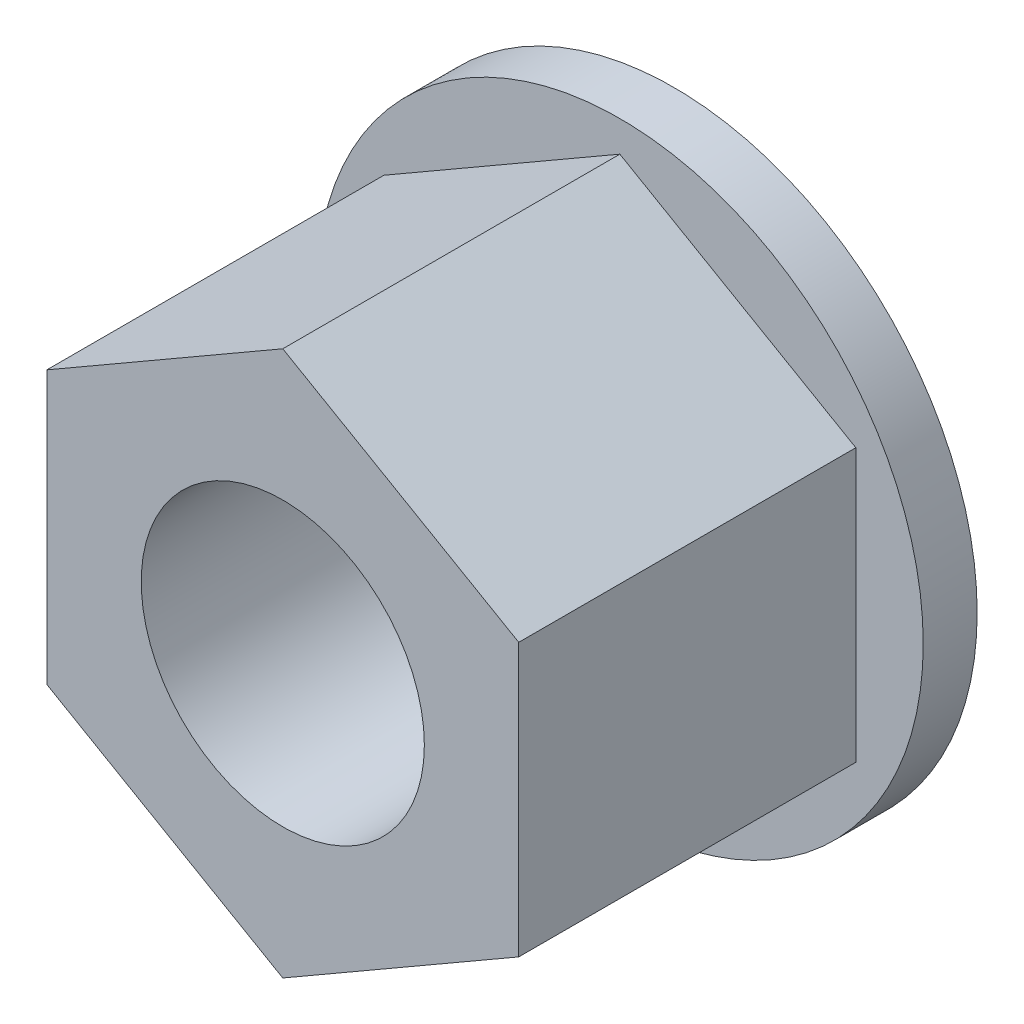
ISO-10303-21;
HEADER;
FILE_DESCRIPTION(('STEP AP214'),'2;1');
FILE_NAME('part.step','',(''),(''),'','','');
FILE_SCHEMA(('AUTOMOTIVE_DESIGN { 1 0 10303 214 1 1 1 1 }'));
ENDSEC;
DATA;
#1=APPLICATION_CONTEXT('core data for automotive mechanical design processes');
#2=APPLICATION_PROTOCOL_DEFINITION('international standard','automotive_design',2000,#1);
#3=PRODUCT_CONTEXT('',#1,'mechanical');
#4=PRODUCT('Part','Part','',(#3));
#5=PRODUCT_RELATED_PRODUCT_CATEGORY('part','',(#4));
#6=PRODUCT_DEFINITION_FORMATION('','',#4);
#7=PRODUCT_DEFINITION_CONTEXT('part definition',#1,'design');
#8=PRODUCT_DEFINITION('design','',#6,#7);
#9=PRODUCT_DEFINITION_SHAPE('','',#8);
#10=(LENGTH_UNIT() NAMED_UNIT(*) SI_UNIT(.MILLI.,.METRE.));
#11=(NAMED_UNIT(*) PLANE_ANGLE_UNIT() SI_UNIT($,.RADIAN.));
#12=(NAMED_UNIT(*) SI_UNIT($,.STERADIAN.) SOLID_ANGLE_UNIT());
#13=UNCERTAINTY_MEASURE_WITH_UNIT(LENGTH_MEASURE(1.E-05),#10,'distance_accuracy_value','');
#14=(GEOMETRIC_REPRESENTATION_CONTEXT(3) GLOBAL_UNCERTAINTY_ASSIGNED_CONTEXT((#13)) GLOBAL_UNIT_ASSIGNED_CONTEXT((#10,
#11,#12)) REPRESENTATION_CONTEXT('',''));
#15=CARTESIAN_POINT('',(0.,0.,0.));
#16=DIRECTION('',(0.,0.,1.));
#17=DIRECTION('',(1.,0.,0.));
#18=AXIS2_PLACEMENT_3D('',#15,#16,#17);
#19=CARTESIAN_POINT('',(0.,0.,0.8));
#20=DIRECTION('',(0.,0.,1.));
#21=DIRECTION('',(1.,0.,0.));
#22=AXIS2_PLACEMENT_3D('',#19,#20,#21);
#23=PLANE('',#22);
#24=DIRECTION('',(0.,1.,0.));
#25=VECTOR('',#24,1.);
#26=CARTESIAN_POINT('',(3.49999999985824,-2.020725942,0.8));
#27=LINE('',#26,#25);
#28=CARTESIAN_POINT('',(3.49999999985824,-2.020725942,0.8));
#29=VERTEX_POINT('',#28);
#30=CARTESIAN_POINT('',(3.49999999985824,2.020725942,0.8));
#31=VERTEX_POINT('',#30);
#32=EDGE_CURVE('E61',#29,#31,#27,.T.);
#33=ORIENTED_EDGE('',*,*,#32,.F.);
#34=DIRECTION('',(0.866025403784439,0.5,0.));
#35=VECTOR('',#34,1.);
#36=CARTESIAN_POINT('',(-7.08800422868916E-11,-4.04145188412277,0.8));
#37=LINE('',#36,#35);
#38=CARTESIAN_POINT('',(-7.08800422868916E-11,-4.04145188412277,0.8));
#39=VERTEX_POINT('',#38);
#40=EDGE_CURVE('E65',#39,#29,#37,.T.);
#41=ORIENTED_EDGE('',*,*,#40,.F.);
#42=DIRECTION('',(0.866025403784439,-0.5,0.));
#43=VECTOR('',#42,1.);
#44=CARTESIAN_POINT('',(-3.5,-2.020725942,0.8));
#45=LINE('',#44,#43);
#46=CARTESIAN_POINT('',(-3.5,-2.020725942,0.8));
#47=VERTEX_POINT('',#46);
#48=EDGE_CURVE('E150',#47,#39,#45,.T.);
#49=ORIENTED_EDGE('',*,*,#48,.F.);
#50=DIRECTION('',(0.,-1.,0.));
#51=VECTOR('',#50,1.);
#52=CARTESIAN_POINT('',(-3.5,2.020725942,0.8));
#53=LINE('',#52,#51);
#54=CARTESIAN_POINT('',(-3.5,2.020725942,0.8));
#55=VERTEX_POINT('',#54);
#56=EDGE_CURVE('E153',#55,#47,#53,.T.);
#57=ORIENTED_EDGE('',*,*,#56,.F.);
#58=DIRECTION('',(-0.866025403784439,-0.5,0.));
#59=VECTOR('',#58,1.);
#60=CARTESIAN_POINT('',(-7.08800422868916E-11,4.04145188412277,0.8));
#61=LINE('',#60,#59);
#62=CARTESIAN_POINT('',(-7.08800422868916E-11,4.04145188412277,0.8));
#63=VERTEX_POINT('',#62);
#64=EDGE_CURVE('E157',#63,#55,#61,.T.);
#65=ORIENTED_EDGE('',*,*,#64,.F.);
#66=DIRECTION('',(-0.866025403784439,0.5,0.));
#67=VECTOR('',#66,1.);
#68=CARTESIAN_POINT('',(3.49999999985824,2.020725942,0.8));
#69=LINE('',#68,#67);
#70=EDGE_CURVE('E161',#31,#63,#69,.T.);
#71=ORIENTED_EDGE('',*,*,#70,.F.);
#72=EDGE_LOOP('',(#33,#41,#49,#57,#65,#71));
#73=FACE_BOUND('',#72,.T.);
#74=CARTESIAN_POINT('',(0.,0.,0.8));
#75=DIRECTION('',(0.,0.,1.));
#76=DIRECTION('',(1.,0.,0.));
#77=AXIS2_PLACEMENT_3D('',#74,#75,#76);
#78=CIRCLE('',#77,4.5);
#79=CARTESIAN_POINT('',(4.5,0.,0.8));
#80=VERTEX_POINT('',#79);
#81=EDGE_CURVE('E11',#80,#80,#78,.T.);
#82=ORIENTED_EDGE('',*,*,#81,.T.);
#83=EDGE_LOOP('',(#82));
#84=FACE_BOUND('',#83,.T.);
#85=ADVANCED_FACE('F45',(#73,#84),#23,.T.);
#86=CARTESIAN_POINT('',(0.,0.,0.));
#87=DIRECTION('',(0.,0.,1.));
#88=DIRECTION('',(1.,0.,0.));
#89=AXIS2_PLACEMENT_3D('',#86,#87,#88);
#90=PLANE('',#89);
#91=CARTESIAN_POINT('',(0.,0.,0.));
#92=DIRECTION('',(0.,0.,1.));
#93=DIRECTION('',(1.,0.,0.));
#94=AXIS2_PLACEMENT_3D('',#91,#92,#93);
#95=CIRCLE('',#94,4.5);
#96=CARTESIAN_POINT('',(4.5,0.,0.));
#97=VERTEX_POINT('',#96);
#98=EDGE_CURVE('E49',#97,#97,#95,.T.);
#99=ORIENTED_EDGE('',*,*,#98,.F.);
#100=EDGE_LOOP('',(#99));
#101=FACE_BOUND('',#100,.T.);
#102=CARTESIAN_POINT('',(0.,0.,0.));
#103=DIRECTION('',(0.,0.,1.));
#104=DIRECTION('',(1.,0.,0.));
#105=AXIS2_PLACEMENT_3D('',#102,#103,#104);
#106=CIRCLE('',#105,2.1);
#107=CARTESIAN_POINT('',(2.1,0.,0.));
#108=VERTEX_POINT('',#107);
#109=EDGE_CURVE('E123',#108,#108,#106,.T.);
#110=ORIENTED_EDGE('',*,*,#109,.T.);
#111=EDGE_LOOP('',(#110));
#112=FACE_BOUND('',#111,.T.);
#113=ADVANCED_FACE('F190',(#101,#112),#90,.F.);
#114=CARTESIAN_POINT('',(0.,0.,0.8));
#115=DIRECTION('',(0.,0.,-1.));
#116=DIRECTION('',(-1.,0.,0.));
#117=AXIS2_PLACEMENT_3D('',#114,#115,#116);
#118=CYLINDRICAL_SURFACE('',#117,4.5);
#119=ORIENTED_EDGE('',*,*,#81,.F.);
#120=EDGE_LOOP('',(#119));
#121=FACE_BOUND('',#120,.T.);
#122=ORIENTED_EDGE('',*,*,#98,.T.);
#123=EDGE_LOOP('',(#122));
#124=FACE_BOUND('',#123,.T.);
#125=ADVANCED_FACE('F47',(#121,#124),#118,.T.);
#126=CARTESIAN_POINT('',(0.,0.,0.8));
#127=DIRECTION('',(0.,0.,-1.));
#128=DIRECTION('',(-1.,0.,0.));
#129=AXIS2_PLACEMENT_3D('',#126,#127,#128);
#130=CYLINDRICAL_SURFACE('',#129,2.1);
#131=ORIENTED_EDGE('',*,*,#109,.F.);
#132=EDGE_LOOP('',(#131));
#133=FACE_BOUND('',#132,.T.);
#134=CARTESIAN_POINT('',(0.,0.,5.8));
#135=DIRECTION('',(0.,0.,1.));
#136=DIRECTION('',(1.,0.,0.));
#137=AXIS2_PLACEMENT_3D('',#134,#135,#136);
#138=CIRCLE('',#137,2.1);
#139=CARTESIAN_POINT('',(2.1,0.,5.8));
#140=VERTEX_POINT('',#139);
#141=EDGE_CURVE('E166',#140,#140,#138,.T.);
#142=ORIENTED_EDGE('',*,*,#141,.T.);
#143=EDGE_LOOP('',(#142));
#144=FACE_BOUND('',#143,.T.);
#145=ADVANCED_FACE('F179',(#133,#144),#130,.F.);
#146=CARTESIAN_POINT('',(0.,0.,5.8));
#147=DIRECTION('',(0.,0.,1.));
#148=DIRECTION('',(1.,0.,0.));
#149=AXIS2_PLACEMENT_3D('',#146,#147,#148);
#150=PLANE('',#149);
#151=DIRECTION('',(0.,1.,0.));
#152=VECTOR('',#151,1.);
#153=CARTESIAN_POINT('',(3.49999999985824,-2.020725942,5.8));
#154=LINE('',#153,#152);
#155=CARTESIAN_POINT('',(3.49999999985824,-2.020725942,5.8));
#156=VERTEX_POINT('',#155);
#157=CARTESIAN_POINT('',(3.49999999985824,2.020725942,5.8));
#158=VERTEX_POINT('',#157);
#159=EDGE_CURVE('E109',#156,#158,#154,.T.);
#160=ORIENTED_EDGE('',*,*,#159,.T.);
#161=DIRECTION('',(-0.866025403784439,0.5,0.));
#162=VECTOR('',#161,1.);
#163=CARTESIAN_POINT('',(3.49999999985824,2.020725942,5.8));
#164=LINE('',#163,#162);
#165=CARTESIAN_POINT('',(-7.08800422868916E-11,4.04145188412277,5.8));
#166=VERTEX_POINT('',#165);
#167=EDGE_CURVE('E97',#158,#166,#164,.T.);
#168=ORIENTED_EDGE('',*,*,#167,.T.);
#169=DIRECTION('',(-0.866025403784439,-0.5,0.));
#170=VECTOR('',#169,1.);
#171=CARTESIAN_POINT('',(-7.08800422868916E-11,4.04145188412277,5.8));
#172=LINE('',#171,#170);
#173=CARTESIAN_POINT('',(-3.5,2.020725942,5.8));
#174=VERTEX_POINT('',#173);
#175=EDGE_CURVE('E108',#166,#174,#172,.T.);
#176=ORIENTED_EDGE('',*,*,#175,.T.);
#177=DIRECTION('',(0.,-1.,0.));
#178=VECTOR('',#177,1.);
#179=CARTESIAN_POINT('',(-3.5,2.020725942,5.8));
#180=LINE('',#179,#178);
#181=CARTESIAN_POINT('',(-3.5,-2.020725942,5.8));
#182=VERTEX_POINT('',#181);
#183=EDGE_CURVE('E172',#174,#182,#180,.T.);
#184=ORIENTED_EDGE('',*,*,#183,.T.);
#185=DIRECTION('',(0.866025403784439,-0.5,0.));
#186=VECTOR('',#185,1.);
#187=CARTESIAN_POINT('',(-3.5,-2.020725942,5.8));
#188=LINE('',#187,#186);
#189=CARTESIAN_POINT('',(-7.08800422868916E-11,-4.04145188412277,5.8));
#190=VERTEX_POINT('',#189);
#191=EDGE_CURVE('E169',#182,#190,#188,.T.);
#192=ORIENTED_EDGE('',*,*,#191,.T.);
#193=DIRECTION('',(0.866025403784439,0.5,0.));
#194=VECTOR('',#193,1.);
#195=CARTESIAN_POINT('',(-7.08800422868916E-11,-4.04145188412277,5.8));
#196=LINE('',#195,#194);
#197=EDGE_CURVE('E115',#190,#156,#196,.T.);
#198=ORIENTED_EDGE('',*,*,#197,.T.);
#199=EDGE_LOOP('',(#160,#168,#176,#184,#192,#198));
#200=FACE_BOUND('',#199,.T.);
#201=ORIENTED_EDGE('',*,*,#141,.F.);
#202=EDGE_LOOP('',(#201));
#203=FACE_BOUND('',#202,.T.);
#204=ADVANCED_FACE('F112',(#200,#203),#150,.T.);
#205=CARTESIAN_POINT('',(3.49999999985824,-2.020725942,5.8));
#206=DIRECTION('',(-1.,0.,0.));
#207=DIRECTION('',(0.,0.,1.));
#208=AXIS2_PLACEMENT_3D('',#205,#206,#207);
#209=PLANE('',#208);
#210=ORIENTED_EDGE('',*,*,#32,.T.);
#211=DIRECTION('',(0.,0.,-1.));
#212=VECTOR('',#211,1.);
#213=CARTESIAN_POINT('',(3.49999999985824,2.020725942,5.8));
#214=LINE('',#213,#212);
#215=EDGE_CURVE('E102',#158,#31,#214,.T.);
#216=ORIENTED_EDGE('',*,*,#215,.F.);
#217=ORIENTED_EDGE('',*,*,#159,.F.);
#218=DIRECTION('',(0.,0.,-1.));
#219=VECTOR('',#218,1.);
#220=CARTESIAN_POINT('',(3.49999999985824,-2.020725942,5.8));
#221=LINE('',#220,#219);
#222=EDGE_CURVE('E145',#156,#29,#221,.T.);
#223=ORIENTED_EDGE('',*,*,#222,.T.);
#224=EDGE_LOOP('',(#210,#216,#217,#223));
#225=FACE_BOUND('',#224,.T.);
#226=ADVANCED_FACE('F121',(#225),#209,.F.);
#227=CARTESIAN_POINT('',(3.49999999985824,2.020725942,5.8));
#228=DIRECTION('',(-0.5,-0.866025403784439,0.));
#229=DIRECTION('',(0.866025403784439,-0.5,0.));
#230=AXIS2_PLACEMENT_3D('',#227,#228,#229);
#231=PLANE('',#230);
#232=ORIENTED_EDGE('',*,*,#70,.T.);
#233=DIRECTION('',(0.,0.,-1.));
#234=VECTOR('',#233,1.);
#235=CARTESIAN_POINT('',(-7.08800422868916E-11,4.04145188412277,5.8));
#236=LINE('',#235,#234);
#237=EDGE_CURVE('E104',#166,#63,#236,.T.);
#238=ORIENTED_EDGE('',*,*,#237,.F.);
#239=ORIENTED_EDGE('',*,*,#167,.F.);
#240=ORIENTED_EDGE('',*,*,#215,.T.);
#241=EDGE_LOOP('',(#232,#238,#239,#240));
#242=FACE_BOUND('',#241,.T.);
#243=ADVANCED_FACE('F100',(#242),#231,.F.);
#244=CARTESIAN_POINT('',(-7.08800422868916E-11,4.04145188412277,5.8));
#245=DIRECTION('',(0.5,-0.866025403784439,0.));
#246=DIRECTION('',(0.866025403784439,0.5,0.));
#247=AXIS2_PLACEMENT_3D('',#244,#245,#246);
#248=PLANE('',#247);
#249=ORIENTED_EDGE('',*,*,#64,.T.);
#250=DIRECTION('',(0.,0.,-1.));
#251=VECTOR('',#250,1.);
#252=CARTESIAN_POINT('',(-3.5,2.020725942,5.8));
#253=LINE('',#252,#251);
#254=EDGE_CURVE('E131',#174,#55,#253,.T.);
#255=ORIENTED_EDGE('',*,*,#254,.F.);
#256=ORIENTED_EDGE('',*,*,#175,.F.);
#257=ORIENTED_EDGE('',*,*,#237,.T.);
#258=EDGE_LOOP('',(#249,#255,#256,#257));
#259=FACE_BOUND('',#258,.T.);
#260=ADVANCED_FACE('F199',(#259),#248,.F.);
#261=CARTESIAN_POINT('',(-3.5,2.020725942,5.8));
#262=DIRECTION('',(1.,0.,0.));
#263=DIRECTION('',(0.,0.,-1.));
#264=AXIS2_PLACEMENT_3D('',#261,#262,#263);
#265=PLANE('',#264);
#266=ORIENTED_EDGE('',*,*,#56,.T.);
#267=DIRECTION('',(0.,0.,-1.));
#268=VECTOR('',#267,1.);
#269=CARTESIAN_POINT('',(-3.5,-2.020725942,5.8));
#270=LINE('',#269,#268);
#271=EDGE_CURVE('E137',#182,#47,#270,.T.);
#272=ORIENTED_EDGE('',*,*,#271,.F.);
#273=ORIENTED_EDGE('',*,*,#183,.F.);
#274=ORIENTED_EDGE('',*,*,#254,.T.);
#275=EDGE_LOOP('',(#266,#272,#273,#274));
#276=FACE_BOUND('',#275,.T.);
#277=ADVANCED_FACE('F202',(#276),#265,.F.);
#278=CARTESIAN_POINT('',(-3.5,-2.020725942,5.8));
#279=DIRECTION('',(0.5,0.866025403784439,0.));
#280=DIRECTION('',(-0.866025403784439,0.5,0.));
#281=AXIS2_PLACEMENT_3D('',#278,#279,#280);
#282=PLANE('',#281);
#283=ORIENTED_EDGE('',*,*,#48,.T.);
#284=DIRECTION('',(0.,0.,-1.));
#285=VECTOR('',#284,1.);
#286=CARTESIAN_POINT('',(-7.08800422868916E-11,-4.04145188412277,5.8));
#287=LINE('',#286,#285);
#288=EDGE_CURVE('E141',#190,#39,#287,.T.);
#289=ORIENTED_EDGE('',*,*,#288,.F.);
#290=ORIENTED_EDGE('',*,*,#191,.F.);
#291=ORIENTED_EDGE('',*,*,#271,.T.);
#292=EDGE_LOOP('',(#283,#289,#290,#291));
#293=FACE_BOUND('',#292,.T.);
#294=ADVANCED_FACE('F206',(#293),#282,.F.);
#295=CARTESIAN_POINT('',(-7.08800422868916E-11,-4.04145188412277,5.8));
#296=DIRECTION('',(-0.5,0.866025403784439,0.));
#297=DIRECTION('',(-0.866025403784439,-0.5,0.));
#298=AXIS2_PLACEMENT_3D('',#295,#296,#297);
#299=PLANE('',#298);
#300=ORIENTED_EDGE('',*,*,#40,.T.);
#301=ORIENTED_EDGE('',*,*,#222,.F.);
#302=ORIENTED_EDGE('',*,*,#197,.F.);
#303=ORIENTED_EDGE('',*,*,#288,.T.);
#304=EDGE_LOOP('',(#300,#301,#302,#303));
#305=FACE_BOUND('',#304,.T.);
#306=ADVANCED_FACE('F209',(#305),#299,.F.);
#307=CLOSED_SHELL('',(#85,#113,#125,#145,#204,#226,#243,#260,#277,#294,#306));
#308=MANIFOLD_SOLID_BREP('B2',#307);
#309=ADVANCED_BREP_SHAPE_REPRESENTATION('',(#18,#308),#14);
#310=SHAPE_DEFINITION_REPRESENTATION(#9,#309);
ENDSEC;
END-ISO-10303-21;
